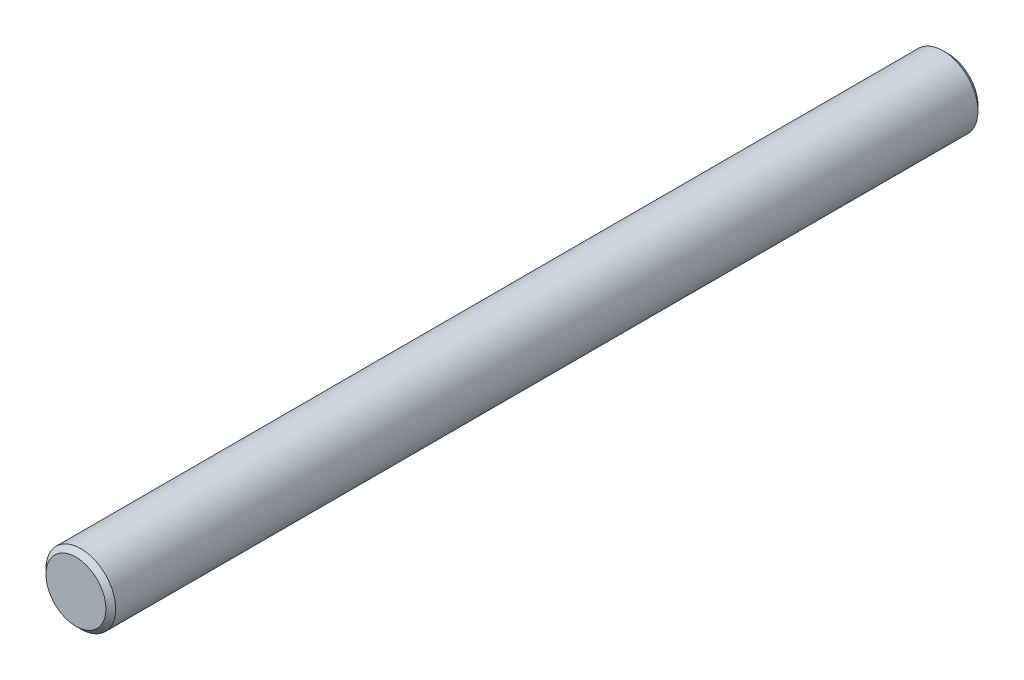
ISO-10303-21;
HEADER;
FILE_DESCRIPTION(('STEP AP214'),'2;1');
FILE_NAME('part.step','',(''),(''),'','','');
FILE_SCHEMA(('AUTOMOTIVE_DESIGN { 1 0 10303 214 1 1 1 1 }'));
ENDSEC;
DATA;
#1=APPLICATION_CONTEXT('core data for automotive mechanical design processes');
#2=APPLICATION_PROTOCOL_DEFINITION('international standard','automotive_design',2000,#1);
#3=PRODUCT_CONTEXT('',#1,'mechanical');
#4=PRODUCT('Part','Part','',(#3));
#5=PRODUCT_RELATED_PRODUCT_CATEGORY('part','',(#4));
#6=PRODUCT_DEFINITION_FORMATION('','',#4);
#7=PRODUCT_DEFINITION_CONTEXT('part definition',#1,'design');
#8=PRODUCT_DEFINITION('design','',#6,#7);
#9=PRODUCT_DEFINITION_SHAPE('','',#8);
#10=(LENGTH_UNIT() NAMED_UNIT(*) SI_UNIT(.MILLI.,.METRE.));
#11=(NAMED_UNIT(*) PLANE_ANGLE_UNIT() SI_UNIT($,.RADIAN.));
#12=(NAMED_UNIT(*) SI_UNIT($,.STERADIAN.) SOLID_ANGLE_UNIT());
#13=UNCERTAINTY_MEASURE_WITH_UNIT(LENGTH_MEASURE(1.E-05),#10,'distance_accuracy_value','');
#14=(GEOMETRIC_REPRESENTATION_CONTEXT(3) GLOBAL_UNCERTAINTY_ASSIGNED_CONTEXT((#13)) GLOBAL_UNIT_ASSIGNED_CONTEXT((#10,
#11,#12)) REPRESENTATION_CONTEXT('',''));
#15=CARTESIAN_POINT('',(0.,0.,0.));
#16=DIRECTION('',(0.,0.,1.));
#17=DIRECTION('',(1.,0.,0.));
#18=AXIS2_PLACEMENT_3D('',#15,#16,#17);
#19=CARTESIAN_POINT('',(0.,0.,50.));
#20=DIRECTION('',(0.,0.,-1.));
#21=DIRECTION('',(-1.,0.,0.));
#22=AXIS2_PLACEMENT_3D('',#19,#20,#21);
#23=CYLINDRICAL_SURFACE('',#22,4.);
#24=CARTESIAN_POINT('',(0.,0.,-49.44));
#25=DIRECTION('',(0.,0.,1.));
#26=DIRECTION('',(1.,0.,0.));
#27=AXIS2_PLACEMENT_3D('',#24,#25,#26);
#28=CIRCLE('',#27,4.);
#29=CARTESIAN_POINT('',(4.,0.,-49.44));
#30=VERTEX_POINT('',#29);
#31=EDGE_CURVE('E46',#30,#30,#28,.T.);
#32=ORIENTED_EDGE('',*,*,#31,.T.);
#33=EDGE_LOOP('',(#32));
#34=FACE_BOUND('',#33,.T.);
#35=CARTESIAN_POINT('',(0.,0.,49.44));
#36=DIRECTION('',(0.,0.,1.));
#37=DIRECTION('',(1.,0.,0.));
#38=AXIS2_PLACEMENT_3D('',#35,#36,#37);
#39=CIRCLE('',#38,4.);
#40=CARTESIAN_POINT('',(4.,0.,49.44));
#41=VERTEX_POINT('',#40);
#42=EDGE_CURVE('E50',#41,#41,#39,.F.);
#43=ORIENTED_EDGE('',*,*,#42,.T.);
#44=EDGE_LOOP('',(#43));
#45=FACE_BOUND('',#44,.T.);
#46=ADVANCED_FACE('F35',(#34,#45),#23,.T.);
#47=CARTESIAN_POINT('',(0.,0.,50.));
#48=DIRECTION('',(0.,0.,1.));
#49=DIRECTION('',(1.,0.,0.));
#50=AXIS2_PLACEMENT_3D('',#47,#48,#49);
#51=PLANE('',#50);
#52=CARTESIAN_POINT('',(0.,0.,50.));
#53=DIRECTION('',(0.,0.,1.));
#54=DIRECTION('',(1.,0.,0.));
#55=AXIS2_PLACEMENT_3D('',#52,#53,#54);
#56=CIRCLE('',#55,3.44);
#57=CARTESIAN_POINT('',(3.44,0.,50.));
#58=VERTEX_POINT('',#57);
#59=EDGE_CURVE('E10',#58,#58,#56,.T.);
#60=ORIENTED_EDGE('',*,*,#59,.T.);
#61=EDGE_LOOP('',(#60));
#62=FACE_BOUND('',#61,.T.);
#63=ADVANCED_FACE('F66',(#62),#51,.T.);
#64=CARTESIAN_POINT('',(0.,0.,-50.));
#65=DIRECTION('',(0.,0.,1.));
#66=DIRECTION('',(1.,0.,0.));
#67=AXIS2_PLACEMENT_3D('',#64,#65,#66);
#68=PLANE('',#67);
#69=CARTESIAN_POINT('',(0.,0.,-50.));
#70=DIRECTION('',(0.,0.,1.));
#71=DIRECTION('',(1.,0.,0.));
#72=AXIS2_PLACEMENT_3D('',#69,#70,#71);
#73=CIRCLE('',#72,3.44000000000001);
#74=CARTESIAN_POINT('',(3.44000000000001,0.,-50.));
#75=VERTEX_POINT('',#74);
#76=EDGE_CURVE('E42',#75,#75,#73,.F.);
#77=ORIENTED_EDGE('',*,*,#76,.T.);
#78=EDGE_LOOP('',(#77));
#79=FACE_BOUND('',#78,.T.);
#80=ADVANCED_FACE('F63',(#79),#68,.F.);
#81=CARTESIAN_POINT('',(0.,0.,-49.44));
#82=DIRECTION('',(0.,0.,1.));
#83=DIRECTION('',(1.,0.,0.));
#84=AXIS2_PLACEMENT_3D('',#81,#82,#83);
#85=CONICAL_SURFACE('',#84,4.,0.785398163397445);
#86=ORIENTED_EDGE('',*,*,#76,.F.);
#87=EDGE_LOOP('',(#86));
#88=FACE_BOUND('',#87,.T.);
#89=ORIENTED_EDGE('',*,*,#31,.F.);
#90=EDGE_LOOP('',(#89));
#91=FACE_BOUND('',#90,.T.);
#92=ADVANCED_FACE('F59',(#88,#91),#85,.T.);
#93=CARTESIAN_POINT('',(0.,0.,50.));
#94=DIRECTION('',(0.,0.,-1.));
#95=DIRECTION('',(-1.,0.,0.));
#96=AXIS2_PLACEMENT_3D('',#93,#94,#95);
#97=CONICAL_SURFACE('',#96,3.44,0.785398163397439);
#98=ORIENTED_EDGE('',*,*,#42,.F.);
#99=EDGE_LOOP('',(#98));
#100=FACE_BOUND('',#99,.T.);
#101=ORIENTED_EDGE('',*,*,#59,.F.);
#102=EDGE_LOOP('',(#101));
#103=FACE_BOUND('',#102,.T.);
#104=ADVANCED_FACE('F37',(#100,#103),#97,.T.);
#105=CLOSED_SHELL('',(#46,#63,#80,#92,#104));
#106=MANIFOLD_SOLID_BREP('B2',#105);
#107=ADVANCED_BREP_SHAPE_REPRESENTATION('',(#18,#106),#14);
#108=SHAPE_DEFINITION_REPRESENTATION(#9,#107);
ENDSEC;
END-ISO-10303-21;
